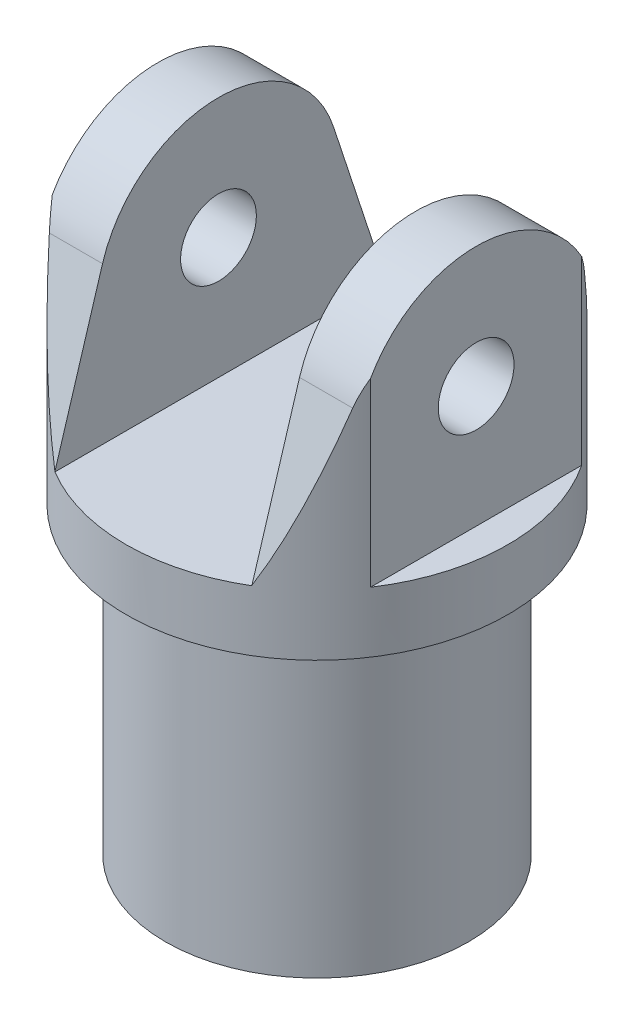
ISO-10303-21;
HEADER;
FILE_DESCRIPTION(('STEP AP214'),'2;1');
FILE_NAME('part.step','',(''),(''),'','','');
FILE_SCHEMA(('AUTOMOTIVE_DESIGN { 1 0 10303 214 1 1 1 1 }'));
ENDSEC;
DATA;
#1=APPLICATION_CONTEXT('core data for automotive mechanical design processes');
#2=APPLICATION_PROTOCOL_DEFINITION('international standard','automotive_design',2000,#1);
#3=PRODUCT_CONTEXT('',#1,'mechanical');
#4=PRODUCT('Part','Part','',(#3));
#5=PRODUCT_RELATED_PRODUCT_CATEGORY('part','',(#4));
#6=PRODUCT_DEFINITION_FORMATION('','',#4);
#7=PRODUCT_DEFINITION_CONTEXT('part definition',#1,'design');
#8=PRODUCT_DEFINITION('design','',#6,#7);
#9=PRODUCT_DEFINITION_SHAPE('','',#8);
#10=(LENGTH_UNIT() NAMED_UNIT(*) SI_UNIT(.MILLI.,.METRE.));
#11=(NAMED_UNIT(*) PLANE_ANGLE_UNIT() SI_UNIT($,.RADIAN.));
#12=(NAMED_UNIT(*) SI_UNIT($,.STERADIAN.) SOLID_ANGLE_UNIT());
#13=UNCERTAINTY_MEASURE_WITH_UNIT(LENGTH_MEASURE(1.E-05),#10,'distance_accuracy_value','');
#14=(GEOMETRIC_REPRESENTATION_CONTEXT(3) GLOBAL_UNCERTAINTY_ASSIGNED_CONTEXT((#13)) GLOBAL_UNIT_ASSIGNED_CONTEXT((#10,
#11,#12)) REPRESENTATION_CONTEXT('',''));
#15=CARTESIAN_POINT('',(0.,0.,0.));
#16=DIRECTION('',(0.,0.,1.));
#17=DIRECTION('',(1.,0.,0.));
#18=AXIS2_PLACEMENT_3D('',#15,#16,#17);
#19=CARTESIAN_POINT('',(0.,25.4,0.));
#20=DIRECTION('',(0.,-1.,0.));
#21=DIRECTION('',(0.,0.,-1.));
#22=AXIS2_PLACEMENT_3D('',#19,#20,#21);
#23=CYLINDRICAL_SURFACE('',#22,8.001);
#24=CARTESIAN_POINT('',(0.,12.7,0.));
#25=DIRECTION('',(0.,-1.,0.));
#26=DIRECTION('',(0.,0.,-1.));
#27=AXIS2_PLACEMENT_3D('',#24,#25,#26);
#28=CIRCLE('',#27,8.001);
#29=CARTESIAN_POINT('',(0.,12.7,-8.001));
#30=VERTEX_POINT('',#29);
#31=EDGE_CURVE('E197',#30,#30,#28,.T.);
#32=ORIENTED_EDGE('',*,*,#31,.F.);
#33=EDGE_LOOP('',(#32));
#34=FACE_BOUND('',#33,.T.);
#35=CARTESIAN_POINT('',(0.,37.7473116180118,0.));
#36=DIRECTION('',(0.,0.291496480429583,0.956571901059803));
#37=DIRECTION('',(0.,-0.956571901059803,0.291496480429583));
#38=AXIS2_PLACEMENT_3D('',#35,#36,#37);
#39=ELLIPSE('',#38,27.4480157983685,8.001);
#40=CARTESIAN_POINT('',(4.1275,15.2547131444835,6.85417717527057));
#41=VERTEX_POINT('',#40);
#42=CARTESIAN_POINT('',(6.35628633089487,21.8008021205823,4.8593852573838));
#43=VERTEX_POINT('',#42);
#44=EDGE_CURVE('E231',#41,#43,#39,.T.);
#45=ORIENTED_EDGE('',*,*,#44,.F.);
#46=DIRECTION('',(0.,-1.,0.));
#47=VECTOR('',#46,1.);
#48=CARTESIAN_POINT('',(4.1275,25.4,6.85417717527057));
#49=LINE('',#48,#47);
#50=CARTESIAN_POINT('',(4.1275,15.24,6.85417717527057));
#51=VERTEX_POINT('',#50);
#52=EDGE_CURVE('E183',#41,#51,#49,.T.);
#53=ORIENTED_EDGE('',*,*,#52,.T.);
#54=CARTESIAN_POINT('',(0.,15.24,0.));
#55=DIRECTION('',(0.,-1.,0.));
#56=DIRECTION('',(0.,0.,-1.));
#57=AXIS2_PLACEMENT_3D('',#54,#55,#56);
#58=CIRCLE('',#57,8.001);
#59=CARTESIAN_POINT('',(-4.1275,15.24,6.85417717527057));
#60=VERTEX_POINT('',#59);
#61=EDGE_CURVE('E191',#51,#60,#58,.T.);
#62=ORIENTED_EDGE('',*,*,#61,.T.);
#63=DIRECTION('',(0.,-1.,0.));
#64=VECTOR('',#63,1.);
#65=CARTESIAN_POINT('',(-4.1275,25.4,6.85417717527056));
#66=LINE('',#65,#64);
#67=CARTESIAN_POINT('',(-4.1275,15.2547131444835,6.85417717527056));
#68=VERTEX_POINT('',#67);
#69=EDGE_CURVE('E188',#60,#68,#66,.F.);
#70=ORIENTED_EDGE('',*,*,#69,.T.);
#71=CARTESIAN_POINT('',(-6.35628633089487,21.8008021205823,4.8593852573838));
#72=VERTEX_POINT('',#71);
#73=EDGE_CURVE('E228',#72,#68,#39,.T.);
#74=ORIENTED_EDGE('',*,*,#73,.F.);
#75=CARTESIAN_POINT('',(-6.3818582121079,21.9069824319913,-4.82575245537429));
#76=CARTESIAN_POINT('',(-6.41696447943664,22.0481556279563,-4.77932175223456));
#77=CARTESIAN_POINT('',(-6.45572979783637,22.1863682619257,-4.72701017432257));
#78=CARTESIAN_POINT('',(-6.53883858771979,22.4561813617296,-4.6113620882551));
#79=CARTESIAN_POINT('',(-6.58317603645649,22.5877887552122,-4.54803745582907));
#80=CARTESIAN_POINT('',(-6.67570609550701,22.8438238538056,-4.41109468173259));
#81=CARTESIAN_POINT('',(-6.72389315788135,22.9682614617001,-4.33749124298696));
#82=CARTESIAN_POINT('',(-6.82262850552279,23.2097747578392,-4.18047534804126));
#83=CARTESIAN_POINT('',(-6.87317749896145,23.3268482131024,-4.0970599384203));
#84=CARTESIAN_POINT('',(-7.02583898824386,23.6656643017208,-3.83334740696888));
#85=CARTESIAN_POINT('',(-7.12940985153656,23.8761640870165,-3.63895818118749));
#86=CARTESIAN_POINT('',(-7.2797891741475,24.1661023303531,-3.3218194081901));
#87=CARTESIAN_POINT('',(-7.32912684696854,24.2585155975149,-3.21174046691585));
#88=CARTESIAN_POINT('',(-7.42503293606469,24.4342371557147,-2.98331991152187));
#89=CARTESIAN_POINT('',(-7.47160114554504,24.5175447672251,-2.86497768181645));
#90=CARTESIAN_POINT('',(-7.56280140640157,24.6778549449556,-2.61505686032618));
#91=CARTESIAN_POINT('',(-7.60725278239579,24.7544067813567,-2.48312259482251));
#92=CARTESIAN_POINT('',(-7.69058931636986,24.8958967029067,-2.21155855895627));
#93=CARTESIAN_POINT('',(-7.7294772534757,24.9608405906904,-2.07193267943697));
#94=CARTESIAN_POINT('',(-7.8004964647373,25.0781848742584,-1.78603574268471));
#95=CARTESIAN_POINT('',(-7.83263554811422,25.1305997773855,-1.63977260664198));
#96=CARTESIAN_POINT('',(-7.88916171931128,25.2220983707352,-1.34168587709212));
#97=CARTESIAN_POINT('',(-7.91355050938911,25.2611849884916,-1.18986351278293));
#98=CARTESIAN_POINT('',(-7.95091710185657,25.3207937983083,-0.903731379498308));
#99=CARTESIAN_POINT('',(-7.96501470210897,25.3431493776965,-0.769947093413882));
#100=CARTESIAN_POINT('',(-7.98647388159654,25.3771077636416,-0.500492187518522));
#101=CARTESIAN_POINT('',(-7.99383639105742,25.3887120551293,-0.3648218308332));
#102=CARTESIAN_POINT('',(-8.00161756196197,25.4009747953018,-0.0928427201766105));
#103=CARTESIAN_POINT('',(-8.00203896351207,25.4016375633172,0.0434657606279117));
#104=CARTESIAN_POINT('',(-7.9959335185402,25.3920179132336,0.315533492286568));
#105=CARTESIAN_POINT('',(-7.9894070555268,25.3817360992543,0.451292773040287));
#106=CARTESIAN_POINT('',(-7.97065681446204,25.3520856069929,0.706539985341112));
#107=CARTESIAN_POINT('',(-7.95912128537319,25.3338131684214,0.826207552313786));
#108=CARTESIAN_POINT('',(-7.93092336920399,25.2889276936945,1.06336512229138));
#109=CARTESIAN_POINT('',(-7.91425942650276,25.2623121267413,1.18085445308304));
#110=CARTESIAN_POINT('',(-7.85708109268077,25.1704100396238,1.52883922564913));
#111=CARTESIAN_POINT('',(-7.80936137128638,25.0930392170804,1.75509410081155));
#112=CARTESIAN_POINT('',(-7.69586699554532,24.9050435357941,2.20116884046775));
#113=CARTESIAN_POINT('',(-7.6293648726444,24.7930566926127,2.42021808651154));
#114=CARTESIAN_POINT('',(-7.48431635364271,24.5409042120507,2.83721892017337));
#115=CARTESIAN_POINT('',(-7.40575850517795,24.4007117408665,3.03515014036796));
#116=CARTESIAN_POINT('',(-7.23005516556072,24.0731254805484,3.4346127233472));
#117=CARTESIAN_POINT('',(-7.13186752929031,23.8818329149022,3.63248693294499));
#118=CARTESIAN_POINT('',(-6.93544370130252,23.4701594293589,3.99475101926504));
#119=CARTESIAN_POINT('',(-6.83720762290861,23.2498035240488,4.15916938517863));
#120=CARTESIAN_POINT('',(-6.66921670316811,22.8295885981073,4.42230575842308));
#121=CARTESIAN_POINT('',(-6.59771163742094,22.6345472557815,4.52758662537274));
#122=CARTESIAN_POINT('',(-6.466589727261,22.2289070055129,4.71297796517436));
#123=CARTESIAN_POINT('',(-6.40698604594255,22.0182912208384,4.79306062419466));
#124=CARTESIAN_POINT('',(-6.35628633089487,21.8008021205823,4.8593852573838));
#125=B_SPLINE_CURVE_WITH_KNOTS('',3,(#75,#76,#77,#78,#79,#80,#81,#82,#83,#84,#85,#86,#87,#88,
#89,#90,#91,#92,#93,#94,#95,#96,#97,#98,#99,#100,#101,#102,#103,#104,#105,#106,#107,#108,#109,
#110,#111,#112,#113,#114,#115,#116,#117,#118,#119,#120,#121,#122,#123,#124),.UNSPECIFIED.,.F.,
.F.,(4,2,2,2,2,2,2,2,2,2,2,2,2,2,2,2,2,2,2,2,2,2,2,2,4),(0.,0.457765372158261,0.915040147724915,
1.37166740708907,1.82843246549891,2.73783156901062,3.1933239045074,3.64885020884558,
4.12481921154079,4.60054961514741,5.07572647162719,5.55079888903854,5.95933214159925,
6.36780896054195,6.77612452326838,7.18441754894083,7.54879802055925,7.9132891301904,
8.64154483294563,9.40318932146122,10.1655618665326,11.0387285212447,11.9111484936612,
12.6077649217525,13.3051476007189),.UNSPECIFIED.);
#126=CARTESIAN_POINT('',(-6.6675,22.8191909190776,4.42271915793892));
#127=VERTEX_POINT('',#126);
#128=EDGE_CURVE('E261',#127,#72,#125,.T.);
#129=ORIENTED_EDGE('',*,*,#128,.F.);
#130=DIRECTION('',(0.,-1.,0.));
#131=VECTOR('',#130,1.);
#132=CARTESIAN_POINT('',(-6.6675,25.4,4.42271915793892));
#133=LINE('',#132,#131);
#134=CARTESIAN_POINT('',(-6.6675,15.24,4.42271915793892));
#135=VERTEX_POINT('',#134);
#136=EDGE_CURVE('E173',#127,#135,#133,.T.);
#137=ORIENTED_EDGE('',*,*,#136,.T.);
#138=CARTESIAN_POINT('',(0.,15.24,0.));
#139=DIRECTION('',(0.,-1.,0.));
#140=DIRECTION('',(0.,0.,-1.));
#141=AXIS2_PLACEMENT_3D('',#138,#139,#140);
#142=CIRCLE('',#141,8.001);
#143=CARTESIAN_POINT('',(-6.6675,15.24,-4.42271915793892));
#144=VERTEX_POINT('',#143);
#145=EDGE_CURVE('E178',#135,#144,#142,.T.);
#146=ORIENTED_EDGE('',*,*,#145,.T.);
#147=DIRECTION('',(0.,-1.,0.));
#148=VECTOR('',#147,1.);
#149=CARTESIAN_POINT('',(-6.6675,25.4,-4.42271915793892));
#150=LINE('',#149,#148);
#151=CARTESIAN_POINT('',(-6.6675,22.8191909190776,-4.42271915793892));
#152=VERTEX_POINT('',#151);
#153=EDGE_CURVE('E175',#144,#152,#150,.F.);
#154=ORIENTED_EDGE('',*,*,#153,.T.);
#155=CARTESIAN_POINT('',(-6.3818582121079,21.9069824319913,-4.82575245537429));
#156=VERTEX_POINT('',#155);
#157=EDGE_CURVE('E267',#156,#152,#125,.T.);
#158=ORIENTED_EDGE('',*,*,#157,.F.);
#159=CARTESIAN_POINT('',(0.,36.5813016248824,0.));
#160=DIRECTION('',(0.,0.31239811653372,-0.94995127074297));
#161=DIRECTION('',(0.,-0.94995127074297,-0.31239811653372));
#162=AXIS2_PLACEMENT_3D('',#159,#160,#161);
#163=ELLIPSE('',#162,25.6115500591899,8.001);
#164=CARTESIAN_POINT('',(-4.1275,15.7388766135174,-6.85417717527057));
#165=VERTEX_POINT('',#164);
#166=EDGE_CURVE('E235',#165,#156,#163,.T.);
#167=ORIENTED_EDGE('',*,*,#166,.F.);
#168=DIRECTION('',(0.,-1.,0.));
#169=VECTOR('',#168,1.);
#170=CARTESIAN_POINT('',(-4.1275,25.4,-6.85417717527056));
#171=LINE('',#170,#169);
#172=CARTESIAN_POINT('',(-4.1275,15.24,-6.85417717527057));
#173=VERTEX_POINT('',#172);
#174=EDGE_CURVE('E185',#165,#173,#171,.T.);
#175=ORIENTED_EDGE('',*,*,#174,.T.);
#176=CARTESIAN_POINT('',(4.1275,15.24,-6.85417717527057));
#177=VERTEX_POINT('',#176);
#178=EDGE_CURVE('E187',#173,#177,#58,.T.);
#179=ORIENTED_EDGE('',*,*,#178,.T.);
#180=DIRECTION('',(0.,-1.,0.));
#181=VECTOR('',#180,1.);
#182=CARTESIAN_POINT('',(4.1275,25.4,-6.85417717527057));
#183=LINE('',#182,#181);
#184=CARTESIAN_POINT('',(4.1275,15.7388766135174,-6.85417717527057));
#185=VERTEX_POINT('',#184);
#186=EDGE_CURVE('E181',#177,#185,#183,.F.);
#187=ORIENTED_EDGE('',*,*,#186,.T.);
#188=CARTESIAN_POINT('',(6.3818582121079,21.9069824319913,-4.82575245537429));
#189=VERTEX_POINT('',#188);
#190=EDGE_CURVE('E164',#189,#185,#163,.T.);
#191=ORIENTED_EDGE('',*,*,#190,.F.);
#192=CARTESIAN_POINT('',(6.6675,22.8191909190776,-4.42271915793893));
#193=CARTESIAN_POINT('',(6.64060049798203,22.7474235319493,-4.4632727491089));
#194=CARTESIAN_POINT('',(6.61426249158972,22.6745034171541,-4.50217442844887));
#195=CARTESIAN_POINT('',(6.56308523237838,22.5266465528583,-4.57645492780741));
#196=CARTESIAN_POINT('',(6.53824217620841,22.4517156889116,-4.61184285075869));
#197=CARTESIAN_POINT('',(6.49028286231315,22.2997391239606,-4.67909570904459));
#198=CARTESIAN_POINT('',(6.46716669351605,22.2226933143238,-4.71096046298978));
#199=CARTESIAN_POINT('',(6.42292026981921,22.0664076686745,-4.77111009545043));
#200=CARTESIAN_POINT('',(6.40179548063183,21.9871625251065,-4.79938519115231));
#201=CARTESIAN_POINT('',(6.3818582121079,21.9069824319913,-4.82575245537429));
#202=B_SPLINE_CURVE_WITH_KNOTS('',3,(#192,#193,#194,#195,#196,#197,#198,#199,#200,#201),
.UNSPECIFIED.,.F.,.F.,(4,2,2,2,4),(0.,0.260117320103658,0.519542149221592,0.778980328545657,
1.03911102693175),.UNSPECIFIED.);
#203=CARTESIAN_POINT('',(6.6675,22.8191909190776,-4.42271915793893));
#204=VERTEX_POINT('',#203);
#205=EDGE_CURVE('E151',#204,#189,#202,.T.);
#206=ORIENTED_EDGE('',*,*,#205,.F.);
#207=DIRECTION('',(0.,-1.,0.));
#208=VECTOR('',#207,1.);
#209=CARTESIAN_POINT('',(6.6675,25.4,-4.42271915793893));
#210=LINE('',#209,#208);
#211=CARTESIAN_POINT('',(6.6675,15.24,-4.42271915793893));
#212=VERTEX_POINT('',#211);
#213=EDGE_CURVE('E67',#204,#212,#210,.T.);
#214=ORIENTED_EDGE('',*,*,#213,.T.);
#215=CARTESIAN_POINT('',(0.,15.24,0.));
#216=DIRECTION('',(0.,-1.,0.));
#217=DIRECTION('',(0.,0.,-1.));
#218=AXIS2_PLACEMENT_3D('',#215,#216,#217);
#219=CIRCLE('',#218,8.001);
#220=CARTESIAN_POINT('',(6.6675,15.24,4.42271915793893));
#221=VERTEX_POINT('',#220);
#222=EDGE_CURVE('E169',#212,#221,#219,.T.);
#223=ORIENTED_EDGE('',*,*,#222,.T.);
#224=DIRECTION('',(0.,-1.,0.));
#225=VECTOR('',#224,1.);
#226=CARTESIAN_POINT('',(6.6675,25.4,4.42271915793893));
#227=LINE('',#226,#225);
#228=CARTESIAN_POINT('',(6.6675,22.8191909190776,4.42271915793893));
#229=VERTEX_POINT('',#228);
#230=EDGE_CURVE('E168',#221,#229,#227,.F.);
#231=ORIENTED_EDGE('',*,*,#230,.T.);
#232=CARTESIAN_POINT('',(6.35628633089487,21.8008021205823,4.8593852573838));
#233=CARTESIAN_POINT('',(6.37723071728465,21.8907161758415,4.83198690736827));
#234=CARTESIAN_POINT('',(6.39972619663132,21.979520916239,4.80219719908629));
#235=CARTESIAN_POINT('',(6.44730173406649,22.1544342623211,4.73813179590434));
#236=CARTESIAN_POINT('',(6.47237292163489,22.2405508724857,4.70387139438276));
#237=CARTESIAN_POINT('',(6.52472592977762,22.4102064812468,4.63097865530976));
#238=CARTESIAN_POINT('',(6.55200758897731,22.4937456673934,4.59234663682503));
#239=CARTESIAN_POINT('',(6.60845847222355,22.658400492748,4.51073729677769));
#240=CARTESIAN_POINT('',(6.6376337074937,22.7395070859663,4.46774586626034));
#241=CARTESIAN_POINT('',(6.6675,22.8191909190776,4.42271915793893));
#242=B_SPLINE_CURVE_WITH_KNOTS('',3,(#232,#233,#234,#235,#236,#237,#238,#239,#240,#241),
.UNSPECIFIED.,.F.,.F.,(4,2,2,2,4),(0.,0.288828610839633,0.576693899026189,0.864538190621095,
1.15334575598128),.UNSPECIFIED.);
#243=EDGE_CURVE('E155',#43,#229,#242,.T.);
#244=ORIENTED_EDGE('',*,*,#243,.F.);
#245=EDGE_LOOP('',(#45,#53,#62,#70,#74,#129,#137,#146,#154,#158,#167,#175,#179,#187,#191,#206,
#214,#223,#231,#244));
#246=FACE_BOUND('',#245,.T.);
#247=ADVANCED_FACE('F59',(#34,#246),#23,.T.);
#248=CARTESIAN_POINT('',(-4.1275,25.4,-8.001));
#249=DIRECTION('',(-1.,0.,0.));
#250=DIRECTION('',(0.,-1.,0.));
#251=AXIS2_PLACEMENT_3D('',#248,#249,#250);
#252=PLANE('',#251);
#253=CARTESIAN_POINT('',(-4.1275,20.32,0.));
#254=DIRECTION('',(-1.,0.,0.));
#255=DIRECTION('',(0.,-1.,0.));
#256=AXIS2_PLACEMENT_3D('',#253,#254,#255);
#257=CIRCLE('',#256,1.5875);
#258=CARTESIAN_POINT('',(-4.1275,18.7325,0.));
#259=VERTEX_POINT('',#258);
#260=EDGE_CURVE('E216',#259,#259,#257,.T.);
#261=ORIENTED_EDGE('',*,*,#260,.T.);
#262=EDGE_LOOP('',(#261));
#263=FACE_BOUND('',#262,.T.);
#264=DIRECTION('',(0.,0.956571901059803,-0.291496480429583));
#265=VECTOR('',#264,1.);
#266=CARTESIAN_POINT('',(-4.1275,28.6801310910565,2.76304500278425));
#267=LINE('',#266,#265);
#268=CARTESIAN_POINT('',(-4.1275,21.8008021205823,4.8593852573838));
#269=VERTEX_POINT('',#268);
#270=EDGE_CURVE('E229',#68,#269,#267,.T.);
#271=ORIENTED_EDGE('',*,*,#270,.F.);
#272=ORIENTED_EDGE('',*,*,#69,.F.);
#273=DIRECTION('',(0.,0.,1.));
#274=VECTOR('',#273,1.);
#275=CARTESIAN_POINT('',(-4.1275,15.24,-8.001));
#276=LINE('',#275,#274);
#277=EDGE_CURVE('E209',#173,#60,#276,.T.);
#278=ORIENTED_EDGE('',*,*,#277,.F.);
#279=ORIENTED_EDGE('',*,*,#174,.F.);
#280=DIRECTION('',(0.,-0.949951270742971,-0.31239811653372));
#281=VECTOR('',#280,1.);
#282=CARTESIAN_POINT('',(-4.1275,24.116811444046,-4.09903473575112));
#283=LINE('',#282,#281);
#284=CARTESIAN_POINT('',(-4.1275,21.9069824319913,-4.82575245537429));
#285=VERTEX_POINT('',#284);
#286=EDGE_CURVE('E236',#285,#165,#283,.T.);
#287=ORIENTED_EDGE('',*,*,#286,.F.);
#288=CARTESIAN_POINT('',(-4.1275,20.32,0.));
#289=DIRECTION('',(-1.,0.,0.));
#290=DIRECTION('',(0.,-1.,0.));
#291=AXIS2_PLACEMENT_3D('',#288,#289,#290);
#292=CIRCLE('',#291,5.08);
#293=EDGE_CURVE('E165',#269,#285,#292,.T.);
#294=ORIENTED_EDGE('',*,*,#293,.F.);
#295=EDGE_LOOP('',(#271,#272,#278,#279,#287,#294));
#296=FACE_BOUND('',#295,.T.);
#297=ADVANCED_FACE('F287',(#263,#296),#252,.F.);
#298=CARTESIAN_POINT('',(4.1275,25.4,-8.001));
#299=DIRECTION('',(1.,0.,0.));
#300=DIRECTION('',(0.,0.,-1.));
#301=AXIS2_PLACEMENT_3D('',#298,#299,#300);
#302=PLANE('',#301);
#303=CARTESIAN_POINT('',(4.1275,20.32,0.));
#304=DIRECTION('',(1.,0.,0.));
#305=DIRECTION('',(0.,0.,-1.));
#306=AXIS2_PLACEMENT_3D('',#303,#304,#305);
#307=CIRCLE('',#306,1.5875);
#308=CARTESIAN_POINT('',(4.1275,20.32,-1.5875));
#309=VERTEX_POINT('',#308);
#310=EDGE_CURVE('E219',#309,#309,#307,.T.);
#311=ORIENTED_EDGE('',*,*,#310,.T.);
#312=EDGE_LOOP('',(#311));
#313=FACE_BOUND('',#312,.T.);
#314=DIRECTION('',(0.,-0.956571901059803,0.291496480429583));
#315=VECTOR('',#314,1.);
#316=CARTESIAN_POINT('',(4.1275,28.6801310910565,2.76304500278425));
#317=LINE('',#316,#315);
#318=CARTESIAN_POINT('',(4.1275,21.8008021205823,4.8593852573838));
#319=VERTEX_POINT('',#318);
#320=EDGE_CURVE('E233',#319,#41,#317,.T.);
#321=ORIENTED_EDGE('',*,*,#320,.F.);
#322=CARTESIAN_POINT('',(4.1275,20.32,0.));
#323=DIRECTION('',(1.,0.,0.));
#324=DIRECTION('',(0.,0.,-1.));
#325=AXIS2_PLACEMENT_3D('',#322,#323,#324);
#326=CIRCLE('',#325,5.08);
#327=CARTESIAN_POINT('',(4.1275,21.9069824319913,-4.82575245537429));
#328=VERTEX_POINT('',#327);
#329=EDGE_CURVE('E270',#328,#319,#326,.T.);
#330=ORIENTED_EDGE('',*,*,#329,.F.);
#331=DIRECTION('',(0.,0.949951270742971,0.31239811653372));
#332=VECTOR('',#331,1.);
#333=CARTESIAN_POINT('',(4.1275,24.116811444046,-4.09903473575112));
#334=LINE('',#333,#332);
#335=EDGE_CURVE('E239',#185,#328,#334,.T.);
#336=ORIENTED_EDGE('',*,*,#335,.F.);
#337=ORIENTED_EDGE('',*,*,#186,.F.);
#338=DIRECTION('',(0.,0.,1.));
#339=VECTOR('',#338,1.);
#340=CARTESIAN_POINT('',(4.1275,15.24,-8.001));
#341=LINE('',#340,#339);
#342=EDGE_CURVE('E204',#177,#51,#341,.T.);
#343=ORIENTED_EDGE('',*,*,#342,.T.);
#344=ORIENTED_EDGE('',*,*,#52,.F.);
#345=EDGE_LOOP('',(#321,#330,#336,#337,#343,#344));
#346=FACE_BOUND('',#345,.T.);
#347=ADVANCED_FACE('F299',(#313,#346),#302,.F.);
#348=CARTESIAN_POINT('',(-6.6675,15.24,-8.001));
#349=DIRECTION('',(1.,0.,0.));
#350=DIRECTION('',(0.,0.,-1.));
#351=AXIS2_PLACEMENT_3D('',#348,#349,#350);
#352=PLANE('',#351);
#353=CARTESIAN_POINT('',(-6.6675,20.32,0.));
#354=DIRECTION('',(1.,0.,0.));
#355=DIRECTION('',(0.,0.,-1.));
#356=AXIS2_PLACEMENT_3D('',#353,#354,#355);
#357=CIRCLE('',#356,1.5875);
#358=CARTESIAN_POINT('',(-6.6675,20.32,-1.5875));
#359=VERTEX_POINT('',#358);
#360=EDGE_CURVE('E222',#359,#359,#357,.T.);
#361=ORIENTED_EDGE('',*,*,#360,.T.);
#362=EDGE_LOOP('',(#361));
#363=FACE_BOUND('',#362,.T.);
#364=CARTESIAN_POINT('',(-6.6675,20.32,0.));
#365=DIRECTION('',(1.,0.,0.));
#366=DIRECTION('',(0.,0.,-1.));
#367=AXIS2_PLACEMENT_3D('',#364,#365,#366);
#368=CIRCLE('',#367,5.08);
#369=EDGE_CURVE('E268',#152,#127,#368,.T.);
#370=ORIENTED_EDGE('',*,*,#369,.F.);
#371=ORIENTED_EDGE('',*,*,#153,.F.);
#372=DIRECTION('',(0.,0.,1.));
#373=VECTOR('',#372,1.);
#374=CARTESIAN_POINT('',(-6.6675,15.24,-8.001));
#375=LINE('',#374,#373);
#376=EDGE_CURVE('E80',#144,#135,#375,.T.);
#377=ORIENTED_EDGE('',*,*,#376,.T.);
#378=ORIENTED_EDGE('',*,*,#136,.F.);
#379=EDGE_LOOP('',(#370,#371,#377,#378));
#380=FACE_BOUND('',#379,.T.);
#381=ADVANCED_FACE('F356',(#363,#380),#352,.F.);
#382=CARTESIAN_POINT('',(6.6675,15.24,-8.001));
#383=DIRECTION('',(-1.,0.,0.));
#384=DIRECTION('',(0.,0.,1.));
#385=AXIS2_PLACEMENT_3D('',#382,#383,#384);
#386=PLANE('',#385);
#387=CARTESIAN_POINT('',(6.6675,20.32,0.));
#388=DIRECTION('',(1.,0.,0.));
#389=DIRECTION('',(0.,0.,-1.));
#390=AXIS2_PLACEMENT_3D('',#387,#388,#389);
#391=CIRCLE('',#390,1.5875);
#392=CARTESIAN_POINT('',(6.6675,20.32,-1.5875));
#393=VERTEX_POINT('',#392);
#394=EDGE_CURVE('E225',#393,#393,#391,.T.);
#395=ORIENTED_EDGE('',*,*,#394,.F.);
#396=EDGE_LOOP('',(#395));
#397=FACE_BOUND('',#396,.T.);
#398=CARTESIAN_POINT('',(6.6675,20.32,0.));
#399=DIRECTION('',(-1.,0.,0.));
#400=DIRECTION('',(0.,0.,1.));
#401=AXIS2_PLACEMENT_3D('',#398,#399,#400);
#402=CIRCLE('',#401,5.08);
#403=EDGE_CURVE('E12',#229,#204,#402,.T.);
#404=ORIENTED_EDGE('',*,*,#403,.F.);
#405=ORIENTED_EDGE('',*,*,#230,.F.);
#406=DIRECTION('',(0.,0.,1.));
#407=VECTOR('',#406,1.);
#408=CARTESIAN_POINT('',(6.6675,15.24,-8.001));
#409=LINE('',#408,#407);
#410=EDGE_CURVE('E73',#212,#221,#409,.T.);
#411=ORIENTED_EDGE('',*,*,#410,.F.);
#412=ORIENTED_EDGE('',*,*,#213,.F.);
#413=EDGE_LOOP('',(#404,#405,#411,#412));
#414=FACE_BOUND('',#413,.T.);
#415=ADVANCED_FACE('F167',(#397,#414),#386,.F.);
#416=CARTESIAN_POINT('',(0.,0.,0.));
#417=DIRECTION('',(0.,1.,0.));
#418=DIRECTION('',(0.,0.,1.));
#419=AXIS2_PLACEMENT_3D('',#416,#417,#418);
#420=PLANE('',#419);
#421=CARTESIAN_POINT('',(0.,0.,0.));
#422=DIRECTION('',(0.,-1.,0.));
#423=DIRECTION('',(0.,0.,-1.));
#424=AXIS2_PLACEMENT_3D('',#421,#422,#423);
#425=CIRCLE('',#424,4.699);
#426=CARTESIAN_POINT('',(0.,0.,-4.699));
#427=VERTEX_POINT('',#426);
#428=EDGE_CURVE('E194',#427,#427,#425,.T.);
#429=ORIENTED_EDGE('',*,*,#428,.F.);
#430=EDGE_LOOP('',(#429));
#431=FACE_BOUND('',#430,.T.);
#432=CARTESIAN_POINT('',(0.,0.,0.));
#433=DIRECTION('',(0.,-1.,0.));
#434=DIRECTION('',(0.,0.,-1.));
#435=AXIS2_PLACEMENT_3D('',#432,#433,#434);
#436=CIRCLE('',#435,6.35);
#437=CARTESIAN_POINT('',(0.,0.,-6.35));
#438=VERTEX_POINT('',#437);
#439=EDGE_CURVE('E200',#438,#438,#436,.T.);
#440=ORIENTED_EDGE('',*,*,#439,.T.);
#441=EDGE_LOOP('',(#440));
#442=FACE_BOUND('',#441,.T.);
#443=ADVANCED_FACE('F349',(#431,#442),#420,.F.);
#444=CARTESIAN_POINT('',(0.,12.7,0.));
#445=DIRECTION('',(0.,-1.,0.));
#446=DIRECTION('',(0.,0.,-1.));
#447=AXIS2_PLACEMENT_3D('',#444,#445,#446);
#448=CYLINDRICAL_SURFACE('',#447,4.699);
#449=CARTESIAN_POINT('',(0.,12.7,0.));
#450=DIRECTION('',(0.,-1.,0.));
#451=DIRECTION('',(0.,0.,-1.));
#452=AXIS2_PLACEMENT_3D('',#449,#450,#451);
#453=CIRCLE('',#452,4.699);
#454=CARTESIAN_POINT('',(0.,12.7,-4.699));
#455=VERTEX_POINT('',#454);
#456=EDGE_CURVE('E193',#455,#455,#453,.T.);
#457=ORIENTED_EDGE('',*,*,#456,.F.);
#458=EDGE_LOOP('',(#457));
#459=FACE_BOUND('',#458,.T.);
#460=ORIENTED_EDGE('',*,*,#428,.T.);
#461=EDGE_LOOP('',(#460));
#462=FACE_BOUND('',#461,.T.);
#463=ADVANCED_FACE('F346',(#459,#462),#448,.F.);
#464=CARTESIAN_POINT('',(0.,12.7,0.));
#465=DIRECTION('',(0.,-1.,0.));
#466=DIRECTION('',(0.,0.,-1.));
#467=AXIS2_PLACEMENT_3D('',#464,#465,#466);
#468=PLANE('',#467);
#469=ORIENTED_EDGE('',*,*,#456,.T.);
#470=EDGE_LOOP('',(#469));
#471=FACE_BOUND('',#470,.T.);
#472=ADVANCED_FACE('F339',(#471),#468,.T.);
#473=CARTESIAN_POINT('',(0.,12.7,0.));
#474=DIRECTION('',(0.,-1.,0.));
#475=DIRECTION('',(0.,0.,-1.));
#476=AXIS2_PLACEMENT_3D('',#473,#474,#475);
#477=CYLINDRICAL_SURFACE('',#476,6.35);
#478=CARTESIAN_POINT('',(0.,12.7,0.));
#479=DIRECTION('',(0.,-1.,0.));
#480=DIRECTION('',(0.,0.,-1.));
#481=AXIS2_PLACEMENT_3D('',#478,#479,#480);
#482=CIRCLE('',#481,6.35);
#483=CARTESIAN_POINT('',(0.,12.7,-6.35));
#484=VERTEX_POINT('',#483);
#485=EDGE_CURVE('E203',#484,#484,#482,.T.);
#486=ORIENTED_EDGE('',*,*,#485,.T.);
#487=EDGE_LOOP('',(#486));
#488=FACE_BOUND('',#487,.T.);
#489=ORIENTED_EDGE('',*,*,#439,.F.);
#490=EDGE_LOOP('',(#489));
#491=FACE_BOUND('',#490,.T.);
#492=ADVANCED_FACE('F331',(#488,#491),#477,.T.);
#493=CARTESIAN_POINT('',(0.,12.7,0.));
#494=DIRECTION('',(0.,-1.,0.));
#495=DIRECTION('',(0.,0.,-1.));
#496=AXIS2_PLACEMENT_3D('',#493,#494,#495);
#497=PLANE('',#496);
#498=ORIENTED_EDGE('',*,*,#485,.F.);
#499=EDGE_LOOP('',(#498));
#500=FACE_BOUND('',#499,.T.);
#501=ORIENTED_EDGE('',*,*,#31,.T.);
#502=EDGE_LOOP('',(#501));
#503=FACE_BOUND('',#502,.T.);
#504=ADVANCED_FACE('F329',(#500,#503),#497,.T.);
#505=CARTESIAN_POINT('',(-4.1275,15.24,-8.001));
#506=DIRECTION('',(0.,-1.,0.));
#507=DIRECTION('',(0.,0.,-1.));
#508=AXIS2_PLACEMENT_3D('',#505,#506,#507);
#509=PLANE('',#508);
#510=ORIENTED_EDGE('',*,*,#342,.F.);
#511=ORIENTED_EDGE('',*,*,#178,.F.);
#512=ORIENTED_EDGE('',*,*,#277,.T.);
#513=ORIENTED_EDGE('',*,*,#61,.F.);
#514=EDGE_LOOP('',(#510,#511,#512,#513));
#515=FACE_BOUND('',#514,.T.);
#516=ADVANCED_FACE('F294',(#515),#509,.F.);
#517=CARTESIAN_POINT('',(-8.001,15.24,-8.001));
#518=DIRECTION('',(0.,-1.,0.));
#519=DIRECTION('',(0.,0.,-1.));
#520=AXIS2_PLACEMENT_3D('',#517,#518,#519);
#521=PLANE('',#520);
#522=ORIENTED_EDGE('',*,*,#376,.F.);
#523=ORIENTED_EDGE('',*,*,#145,.F.);
#524=EDGE_LOOP('',(#522,#523));
#525=FACE_BOUND('',#524,.T.);
#526=ADVANCED_FACE('F310',(#525),#521,.F.);
#527=CARTESIAN_POINT('',(6.6675,15.24,-8.001));
#528=DIRECTION('',(0.,-1.,0.));
#529=DIRECTION('',(0.,0.,-1.));
#530=AXIS2_PLACEMENT_3D('',#527,#528,#529);
#531=PLANE('',#530);
#532=ORIENTED_EDGE('',*,*,#410,.T.);
#533=ORIENTED_EDGE('',*,*,#222,.F.);
#534=EDGE_LOOP('',(#532,#533));
#535=FACE_BOUND('',#534,.T.);
#536=ADVANCED_FACE('F307',(#535),#531,.F.);
#537=CARTESIAN_POINT('',(-8.001,20.32,0.));
#538=DIRECTION('',(1.,0.,0.));
#539=DIRECTION('',(0.,0.,-1.));
#540=AXIS2_PLACEMENT_3D('',#537,#538,#539);
#541=CYLINDRICAL_SURFACE('',#540,1.5875);
#542=ORIENTED_EDGE('',*,*,#394,.T.);
#543=EDGE_LOOP('',(#542));
#544=FACE_BOUND('',#543,.T.);
#545=ORIENTED_EDGE('',*,*,#310,.F.);
#546=EDGE_LOOP('',(#545));
#547=FACE_BOUND('',#546,.T.);
#548=ADVANCED_FACE('F309',(#544,#547),#541,.F.);
#549=ORIENTED_EDGE('',*,*,#360,.F.);
#550=EDGE_LOOP('',(#549));
#551=FACE_BOUND('',#550,.T.);
#552=ORIENTED_EDGE('',*,*,#260,.F.);
#553=EDGE_LOOP('',(#552));
#554=FACE_BOUND('',#553,.T.);
#555=ADVANCED_FACE('F316',(#551,#554),#541,.F.);
#556=CARTESIAN_POINT('',(-8.001,20.32,0.));
#557=DIRECTION('',(1.,0.,0.));
#558=DIRECTION('',(0.,0.,-1.));
#559=AXIS2_PLACEMENT_3D('',#556,#557,#558);
#560=CYLINDRICAL_SURFACE('',#559,5.08);
#561=ORIENTED_EDGE('',*,*,#329,.T.);
#562=DIRECTION('',(1.,0.,0.));
#563=VECTOR('',#562,1.);
#564=CARTESIAN_POINT('',(-8.001,21.8008021205823,4.8593852573838));
#565=LINE('',#564,#563);
#566=EDGE_CURVE('E305',#319,#43,#565,.T.);
#567=ORIENTED_EDGE('',*,*,#566,.T.);
#568=ORIENTED_EDGE('',*,*,#243,.T.);
#569=ORIENTED_EDGE('',*,*,#403,.T.);
#570=ORIENTED_EDGE('',*,*,#205,.T.);
#571=DIRECTION('',(1.,0.,0.));
#572=VECTOR('',#571,1.);
#573=CARTESIAN_POINT('',(-8.001,21.9069824319913,-4.82575245537429));
#574=LINE('',#573,#572);
#575=EDGE_CURVE('E284',#328,#189,#574,.T.);
#576=ORIENTED_EDGE('',*,*,#575,.F.);
#577=EDGE_LOOP('',(#561,#567,#568,#569,#570,#576));
#578=FACE_BOUND('',#577,.T.);
#579=ADVANCED_FACE('F149',(#578),#560,.T.);
#580=CARTESIAN_POINT('',(-8.001,3.57006372289603,-10.8559763670419));
#581=DIRECTION('',(0.,0.31239811653372,-0.94995127074297));
#582=DIRECTION('',(0.,0.949951270742971,0.31239811653372));
#583=AXIS2_PLACEMENT_3D('',#580,#581,#582);
#584=PLANE('',#583);
#585=ORIENTED_EDGE('',*,*,#190,.T.);
#586=ORIENTED_EDGE('',*,*,#335,.T.);
#587=ORIENTED_EDGE('',*,*,#575,.T.);
#588=EDGE_LOOP('',(#585,#586,#587));
#589=FACE_BOUND('',#588,.T.);
#590=ADVANCED_FACE('F303',(#589),#584,.T.);
#591=CARTESIAN_POINT('',(-8.001,3.20739654603187,10.5253600556989));
#592=DIRECTION('',(0.,0.291496480429583,0.956571901059803));
#593=DIRECTION('',(0.,-0.956571901059803,0.291496480429583));
#594=AXIS2_PLACEMENT_3D('',#591,#592,#593);
#595=PLANE('',#594);
#596=ORIENTED_EDGE('',*,*,#44,.T.);
#597=ORIENTED_EDGE('',*,*,#566,.F.);
#598=ORIENTED_EDGE('',*,*,#320,.T.);
#599=EDGE_LOOP('',(#596,#597,#598));
#600=FACE_BOUND('',#599,.T.);
#601=ADVANCED_FACE('F426',(#600),#595,.T.);
#602=ORIENTED_EDGE('',*,*,#73,.T.);
#603=ORIENTED_EDGE('',*,*,#270,.T.);
#604=EDGE_CURVE('E278',#72,#269,#565,.T.);
#605=ORIENTED_EDGE('',*,*,#604,.F.);
#606=EDGE_LOOP('',(#602,#603,#605));
#607=FACE_BOUND('',#606,.T.);
#608=ADVANCED_FACE('F256',(#607),#595,.T.);
#609=ORIENTED_EDGE('',*,*,#166,.T.);
#610=EDGE_CURVE('E275',#156,#285,#574,.T.);
#611=ORIENTED_EDGE('',*,*,#610,.T.);
#612=ORIENTED_EDGE('',*,*,#286,.T.);
#613=EDGE_LOOP('',(#609,#611,#612));
#614=FACE_BOUND('',#613,.T.);
#615=ADVANCED_FACE('F254',(#614),#584,.T.);
#616=ORIENTED_EDGE('',*,*,#369,.T.);
#617=ORIENTED_EDGE('',*,*,#128,.T.);
#618=ORIENTED_EDGE('',*,*,#604,.T.);
#619=ORIENTED_EDGE('',*,*,#293,.T.);
#620=ORIENTED_EDGE('',*,*,#610,.F.);
#621=ORIENTED_EDGE('',*,*,#157,.T.);
#622=EDGE_LOOP('',(#616,#617,#618,#619,#620,#621));
#623=FACE_BOUND('',#622,.T.);
#624=ADVANCED_FACE('F249',(#623),#560,.T.);
#625=CLOSED_SHELL('',(#247,#297,#347,#381,#415,#443,#463,#472,#492,#504,#516,#526,#536,#548,
#555,#579,#590,#601,#608,#615,#624));
#626=MANIFOLD_SOLID_BREP('B2',#625);
#627=ADVANCED_BREP_SHAPE_REPRESENTATION('',(#18,#626),#14);
#628=SHAPE_DEFINITION_REPRESENTATION(#9,#627);
ENDSEC;
END-ISO-10303-21;
